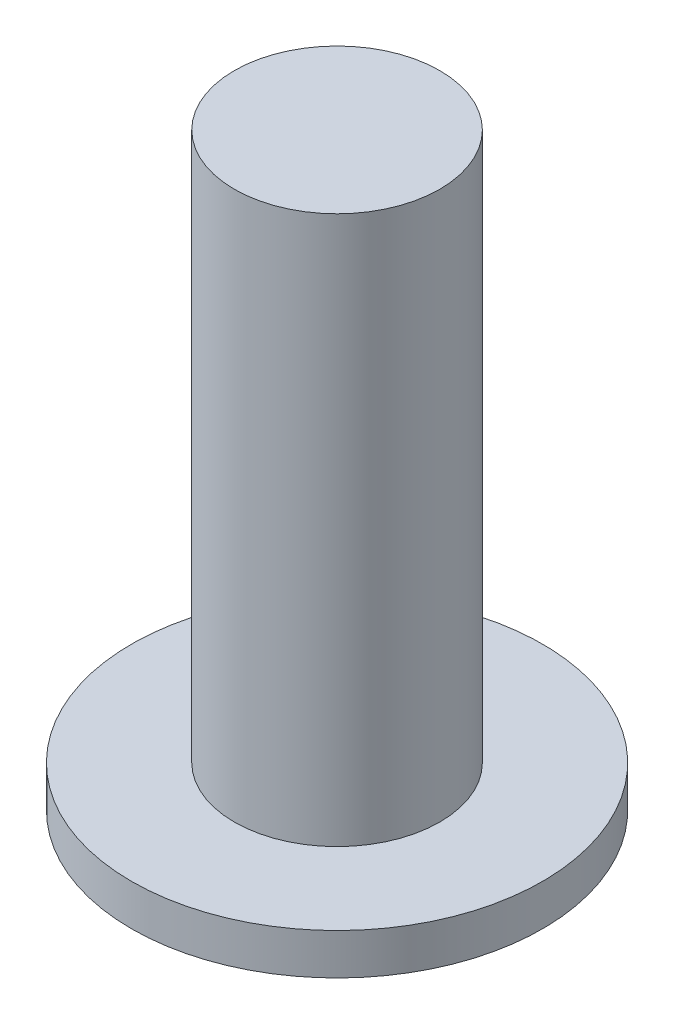
ISO-10303-21;
HEADER;
FILE_DESCRIPTION(('STEP AP214'),'2;1');
FILE_NAME('part.step','',(''),(''),'','','');
FILE_SCHEMA(('AUTOMOTIVE_DESIGN { 1 0 10303 214 1 1 1 1 }'));
ENDSEC;
DATA;
#1=APPLICATION_CONTEXT('core data for automotive mechanical design processes');
#2=APPLICATION_PROTOCOL_DEFINITION('international standard','automotive_design',2000,#1);
#3=PRODUCT_CONTEXT('',#1,'mechanical');
#4=PRODUCT('Part','Part','',(#3));
#5=PRODUCT_RELATED_PRODUCT_CATEGORY('part','',(#4));
#6=PRODUCT_DEFINITION_FORMATION('','',#4);
#7=PRODUCT_DEFINITION_CONTEXT('part definition',#1,'design');
#8=PRODUCT_DEFINITION('design','',#6,#7);
#9=PRODUCT_DEFINITION_SHAPE('','',#8);
#10=(LENGTH_UNIT() NAMED_UNIT(*) SI_UNIT(.MILLI.,.METRE.));
#11=(NAMED_UNIT(*) PLANE_ANGLE_UNIT() SI_UNIT($,.RADIAN.));
#12=(NAMED_UNIT(*) SI_UNIT($,.STERADIAN.) SOLID_ANGLE_UNIT());
#13=UNCERTAINTY_MEASURE_WITH_UNIT(LENGTH_MEASURE(1.E-05),#10,'distance_accuracy_value','');
#14=(GEOMETRIC_REPRESENTATION_CONTEXT(3) GLOBAL_UNCERTAINTY_ASSIGNED_CONTEXT((#13)) GLOBAL_UNIT_ASSIGNED_CONTEXT((#10,
#11,#12)) REPRESENTATION_CONTEXT('',''));
#15=CARTESIAN_POINT('',(0.,0.,0.));
#16=DIRECTION('',(0.,0.,1.));
#17=DIRECTION('',(1.,0.,0.));
#18=AXIS2_PLACEMENT_3D('',#15,#16,#17);
#19=CARTESIAN_POINT('',(0.,30.,0.));
#20=DIRECTION('',(0.,-1.,0.));
#21=DIRECTION('',(0.,0.,-1.));
#22=AXIS2_PLACEMENT_3D('',#19,#20,#21);
#23=CYLINDRICAL_SURFACE('',#22,150.);
#24=CARTESIAN_POINT('',(0.,30.,0.));
#25=DIRECTION('',(0.,1.,0.));
#26=DIRECTION('',(0.,0.,1.));
#27=AXIS2_PLACEMENT_3D('',#24,#25,#26);
#28=CIRCLE('',#27,150.);
#29=CARTESIAN_POINT('',(0.,30.,150.));
#30=VERTEX_POINT('',#29);
#31=EDGE_CURVE('E41',#30,#30,#28,.T.);
#32=ORIENTED_EDGE('',*,*,#31,.F.);
#33=EDGE_LOOP('',(#32));
#34=FACE_BOUND('',#33,.T.);
#35=CARTESIAN_POINT('',(0.,0.,0.));
#36=DIRECTION('',(0.,1.,0.));
#37=DIRECTION('',(0.,0.,1.));
#38=AXIS2_PLACEMENT_3D('',#35,#36,#37);
#39=CIRCLE('',#38,150.);
#40=CARTESIAN_POINT('',(0.,0.,150.));
#41=VERTEX_POINT('',#40);
#42=EDGE_CURVE('E45',#41,#41,#39,.T.);
#43=ORIENTED_EDGE('',*,*,#42,.T.);
#44=EDGE_LOOP('',(#43));
#45=FACE_BOUND('',#44,.T.);
#46=ADVANCED_FACE('F31',(#34,#45),#23,.T.);
#47=CARTESIAN_POINT('',(0.,30.,0.));
#48=DIRECTION('',(0.,1.,0.));
#49=DIRECTION('',(0.,0.,1.));
#50=AXIS2_PLACEMENT_3D('',#47,#48,#49);
#51=PLANE('',#50);
#52=CARTESIAN_POINT('',(0.,30.,0.));
#53=DIRECTION('',(0.,1.,0.));
#54=DIRECTION('',(0.,0.,1.));
#55=AXIS2_PLACEMENT_3D('',#52,#53,#54);
#56=CIRCLE('',#55,75.);
#57=CARTESIAN_POINT('',(0.,30.,75.));
#58=VERTEX_POINT('',#57);
#59=EDGE_CURVE('E52',#58,#58,#56,.T.);
#60=ORIENTED_EDGE('',*,*,#59,.F.);
#61=EDGE_LOOP('',(#60));
#62=FACE_BOUND('',#61,.T.);
#63=ORIENTED_EDGE('',*,*,#31,.T.);
#64=EDGE_LOOP('',(#63));
#65=FACE_BOUND('',#64,.T.);
#66=ADVANCED_FACE('F77',(#62,#65),#51,.T.);
#67=CARTESIAN_POINT('',(0.,0.,0.));
#68=DIRECTION('',(0.,1.,0.));
#69=DIRECTION('',(0.,0.,1.));
#70=AXIS2_PLACEMENT_3D('',#67,#68,#69);
#71=PLANE('',#70);
#72=ORIENTED_EDGE('',*,*,#42,.F.);
#73=EDGE_LOOP('',(#72));
#74=FACE_BOUND('',#73,.T.);
#75=ADVANCED_FACE('F83',(#74),#71,.F.);
#76=CARTESIAN_POINT('',(0.,430.,0.));
#77=DIRECTION('',(0.,-1.,0.));
#78=DIRECTION('',(0.,0.,-1.));
#79=AXIS2_PLACEMENT_3D('',#76,#77,#78);
#80=CYLINDRICAL_SURFACE('',#79,75.);
#81=CARTESIAN_POINT('',(0.,404.99487629361,-75.));
#82=CARTESIAN_POINT('',(-1.25607912812857,404.994875564138,-74.9999993698066));
#83=CARTESIAN_POINT('',(-2.51216621493512,404.947480910228,-74.9683781127444));
#84=CARTESIAN_POINT('',(-5.01407179790327,404.758648172408,-74.8426887060203));
#85=CARTESIAN_POINT('',(-6.25989023998238,404.617209593512,-74.7486202276763));
#86=CARTESIAN_POINT('',(-8.73197178564374,404.24237698436,-74.5003130126054));
#87=CARTESIAN_POINT('',(-9.95822707214632,404.008947108478,-74.3460508208325));
#88=CARTESIAN_POINT('',(-12.3818417737217,403.45347510448,-73.9810246710384));
#89=CARTESIAN_POINT('',(-13.5792008392033,403.131431904889,-73.7702600298146));
#90=CARTESIAN_POINT('',(-15.9317078782539,402.404677491534,-73.2981128358346));
#91=CARTESIAN_POINT('',(-17.0870301802537,402.000368558155,-73.0369769106045));
#92=CARTESIAN_POINT('',(-19.3551767652093,401.112772889994,-72.4689183409078));
#93=CARTESIAN_POINT('',(-20.4680012679968,400.629486563813,-72.1619959333249));
#94=CARTESIAN_POINT('',(-22.6461387426976,399.588703509854,-71.5083591550587));
#95=CARTESIAN_POINT('',(-23.7114516150577,399.031206626588,-71.1616447010027));
#96=CARTESIAN_POINT('',(-25.790674262574,397.846632218866,-70.4347519114061));
#97=CARTESIAN_POINT('',(-26.8045815363435,397.219551313188,-70.0545719498984));
#98=CARTESIAN_POINT('',(-28.861666612515,395.844137976592,-69.2338946093332));
#99=CARTESIAN_POINT('',(-29.9000336318079,395.090032584437,-68.7910162573519));
#100=CARTESIAN_POINT('',(-31.9096887774616,393.509886111997,-67.8821640514135));
#101=CARTESIAN_POINT('',(-32.8809738546755,392.683841765647,-67.4161891492757));
#102=CARTESIAN_POINT('',(-34.7552786574204,390.96280017407,-66.4693490833564));
#103=CARTESIAN_POINT('',(-35.6582055457982,390.067712375426,-65.9884648769671));
#104=CARTESIAN_POINT('',(-37.3921493416695,388.212930166738,-65.0216326378612));
#105=CARTESIAN_POINT('',(-38.2231619954507,387.25323194096,-64.5356843075049));
#106=CARTESIAN_POINT('',(-39.9363542944057,385.115445277059,-63.4920916222783));
#107=CARTESIAN_POINT('',(-40.8058966108144,383.926799591419,-62.9352413406697));
#108=CARTESIAN_POINT('',(-42.4412194084599,381.469790792172,-61.8442348361324));
#109=CARTESIAN_POINT('',(-43.2069763287394,380.201409672683,-61.3100837851243));
#110=CARTESIAN_POINT('',(-44.6279110067148,377.590357210436,-60.2836354938936));
#111=CARTESIAN_POINT('',(-45.2832388239399,376.247790028291,-59.7912819152601));
#112=CARTESIAN_POINT('',(-46.477113565685,373.49165100251,-58.8680528583209));
#113=CARTESIAN_POINT('',(-47.0157165797184,372.078113666007,-58.4371478864466));
#114=CARTESIAN_POINT('',(-47.830072193067,369.604999323424,-57.7708886748411));
#115=CARTESIAN_POINT('',(-48.1368155051018,368.56107672876,-57.5149970636582));
#116=CARTESIAN_POINT('',(-48.6835315046211,366.445078579865,-57.0529757946606));
#117=CARTESIAN_POINT('',(-48.9235150911959,365.3730076524,-56.8468380148399));
#118=CARTESIAN_POINT('',(-49.3331558129826,363.207781105513,-56.4917106885635));
#119=CARTESIAN_POINT('',(-49.5029168061961,362.114659144435,-56.3426367701874));
#120=CARTESIAN_POINT('',(-49.7699049552906,359.912819952143,-56.1069379732519));
#121=CARTESIAN_POINT('',(-49.867131713662,358.804102635495,-56.0203134369341));
#122=CARTESIAN_POINT('',(-49.9875475202756,356.574810871641,-55.9128944879588));
#123=CARTESIAN_POINT('',(-50.0104283098638,355.454206336164,-55.8923741643938));
#124=CARTESIAN_POINT('',(-49.9808494482603,353.214799379829,-55.9188255085255));
#125=CARTESIAN_POINT('',(-49.9283895411501,352.095996965105,-55.9657974054809));
#126=CARTESIAN_POINT('',(-49.7490517210388,349.868314552156,-56.1252713875889));
#127=CARTESIAN_POINT('',(-49.6221185124382,348.759442548905,-56.2378221639021));
#128=CARTESIAN_POINT('',(-49.2960030517688,346.56043525283,-56.523896635261));
#129=CARTESIAN_POINT('',(-49.096819421764,345.470300317768,-56.6974214931824));
#130=CARTESIAN_POINT('',(-48.6396771274884,343.363374579384,-57.0900007448472));
#131=CARTESIAN_POINT('',(-48.3847316806037,342.345479723624,-57.3066828254853));
#132=CARTESIAN_POINT('',(-47.8145330995113,340.336738078613,-57.7832883093608));
#133=CARTESIAN_POINT('',(-47.4992566301012,339.345901925301,-58.0432284391238));
#134=CARTESIAN_POINT('',(-46.8113917004493,337.394766290915,-58.5993950372135));
#135=CARTESIAN_POINT('',(-46.438797308073,336.434469982998,-58.8956252607466));
#136=CARTESIAN_POINT('',(-45.6391782628871,334.546996116042,-59.5174078681792));
#137=CARTESIAN_POINT('',(-45.2121657224681,333.619811245674,-59.8429537222896));
#138=CARTESIAN_POINT('',(-44.2137646179634,331.614541276171,-60.5855151497398));
#139=CARTESIAN_POINT('',(-43.6306819621446,330.544166932534,-61.0076592120658));
#140=CARTESIAN_POINT('',(-42.3925789941529,328.455404496886,-61.8743922620619));
#141=CARTESIAN_POINT('',(-41.7375518119237,327.437021383197,-62.3189833910314));
#142=CARTESIAN_POINT('',(-40.3576530583814,325.453017204421,-63.2213580852144));
#143=CARTESIAN_POINT('',(-39.632705438216,324.487455419969,-63.6791556264036));
#144=CARTESIAN_POINT('',(-38.1158937470748,322.612271529272,-64.5984937314697));
#145=CARTESIAN_POINT('',(-37.3240252312427,321.702653145706,-65.0600345421293));
#146=CARTESIAN_POINT('',(-35.497372051376,319.751620940792,-66.0776235582573));
#147=CARTESIAN_POINT('',(-34.4470402023713,318.724118581485,-66.6325757543582));
#148=CARTESIAN_POINT('',(-32.2536688932062,316.760497228696,-67.7214915689028));
#149=CARTESIAN_POINT('',(-31.1106124377159,315.824395057395,-68.2554513129291));
#150=CARTESIAN_POINT('',(-28.7367153713934,314.051080677518,-69.2883502743307));
#151=CARTESIAN_POINT('',(-27.5059401512503,313.213796016057,-69.7873150396944));
#152=CARTESIAN_POINT('',(-24.9611838354465,311.645463202094,-70.7374190864949));
#153=CARTESIAN_POINT('',(-23.6472257774534,310.914385818463,-71.1885715179035));
#154=CARTESIAN_POINT('',(-21.2083653108556,309.699399932566,-71.9479110139699));
#155=CARTESIAN_POINT('',(-20.0968929420696,309.195132357876,-72.2667869938167));
#156=CARTESIAN_POINT('',(-17.8296258698227,308.265818383993,-72.85929326387));
#157=CARTESIAN_POINT('',(-16.673836366692,307.840762723885,-73.1329288428511));
#158=CARTESIAN_POINT('',(-14.3248068195827,307.074891805132,-73.629069378325));
#159=CARTESIAN_POINT('',(-13.1315925392313,306.734019968167,-73.851608668537));
#160=CARTESIAN_POINT('',(-10.7143858099321,306.140495315282,-74.2408263731253));
#161=CARTESIAN_POINT('',(-9.49039288783282,305.88784385644,-74.4075039281895));
#162=CARTESIAN_POINT('',(-7.01493285874871,305.473443008745,-74.6816447374107));
#163=CARTESIAN_POINT('',(-5.76336899758283,305.312096055782,-74.7888458016147));
#164=CARTESIAN_POINT('',(-3.24779978664342,305.084489912725,-74.9402390053893));
#165=CARTESIAN_POINT('',(-1.98379442061503,305.01823084688,-74.9844310626274));
#166=CARTESIAN_POINT('',(0.546161841066413,304.981856211462,-75.0086794877959));
#167=CARTESIAN_POINT('',(1.81211265438217,305.011736679207,-74.9887384991651));
#168=CARTESIAN_POINT('',(4.33545391961122,305.167157654873,-74.8852333079176));
#169=CARTESIAN_POINT('',(5.59284473457238,305.292694079996,-74.8016718207584));
#170=CARTESIAN_POINT('',(8.00105441027869,305.625298120784,-74.5811036267321));
#171=CARTESIAN_POINT('',(9.1531452914309,305.826005430597,-74.4482725106456));
#172=CARTESIAN_POINT('',(11.4337539392524,306.305791015734,-74.1322766203661));
#173=CARTESIAN_POINT('',(12.5622730289194,306.584864879866,-73.949114679269));
#174=CARTESIAN_POINT('',(14.7892901799927,307.218131913167,-73.5361116664003));
#175=CARTESIAN_POINT('',(15.8877862817803,307.572329972584,-73.3062675558711));
#176=CARTESIAN_POINT('',(18.049159634921,308.352106467448,-72.8042512368363));
#177=CARTESIAN_POINT('',(19.1120349853727,308.777688705059,-72.5320767737295));
#178=CARTESIAN_POINT('',(21.2606669620087,309.724088208852,-71.9326221103305));
#179=CARTESIAN_POINT('',(22.3439174615028,310.249109479372,-71.6030042281149));
#180=CARTESIAN_POINT('',(24.4608128159455,311.370301795432,-70.9077575538377));
#181=CARTESIAN_POINT('',(25.4944561768914,311.966474981948,-70.5421276782251));
#182=CARTESIAN_POINT('',(27.5092556070297,313.225833436575,-69.7810939835077));
#183=CARTESIAN_POINT('',(28.4903864915725,313.88905042573,-69.3856760932846));
#184=CARTESIAN_POINT('',(30.3970494244,315.278243084403,-68.5718169662428));
#185=CARTESIAN_POINT('',(31.3225783792393,316.004222240261,-68.1533744509126));
#186=CARTESIAN_POINT('',(33.2578367830242,317.634994048074,-67.2327199395352));
#187=CARTESIAN_POINT('',(34.2577309571889,318.549907603827,-66.7277262920163));
#188=CARTESIAN_POINT('',(36.1774209126817,320.454710052379,-65.7067457352922));
#189=CARTESIAN_POINT('',(37.0972060552405,321.444608870952,-65.1907573772406));
#190=CARTESIAN_POINT('',(38.8544700404428,323.496370482948,-64.1589349247197));
#191=CARTESIAN_POINT('',(39.691892558769,324.558281695597,-63.6431011730333));
#192=CARTESIAN_POINT('',(41.2805689258953,326.750464755456,-62.6243153729962));
#193=CARTESIAN_POINT('',(42.0318315760824,327.880729602171,-62.121362012974));
#194=CARTESIAN_POINT('',(43.3846567848418,330.108669424688,-61.1832557575179));
#195=CARTESIAN_POINT('',(43.9935060872521,331.201018867336,-60.745965914224));
#196=CARTESIAN_POINT('',(45.1321365873981,333.438763291756,-59.9048518116807));
#197=CARTESIAN_POINT('',(45.6619166396943,334.58415904167,-59.5010280372766));
#198=CARTESIAN_POINT('',(46.6370927792576,336.923222723951,-58.7397976554786));
#199=CARTESIAN_POINT('',(47.0826123234842,338.116816873576,-58.3823233831285));
#200=CARTESIAN_POINT('',(47.8848711143105,340.549189290362,-57.7261478382676));
#201=CARTESIAN_POINT('',(48.2416307641526,341.787957098244,-57.4274330620194));
#202=CARTESIAN_POINT('',(48.8051035565204,344.077419684007,-56.9488612803433));
#203=CARTESIAN_POINT('',(49.0272622949112,345.121876261805,-56.7572902091628));
#204=CARTESIAN_POINT('',(49.4051907333318,347.231204559975,-56.4286284860003));
#205=CARTESIAN_POINT('',(49.5609684301523,348.296073805112,-56.2915312717968));
#206=CARTESIAN_POINT('',(49.8036343737896,350.438648316526,-56.0769505606046));
#207=CARTESIAN_POINT('',(49.8905860975372,351.516340822638,-55.9994121355965));
#208=CARTESIAN_POINT('',(49.9943596361803,353.677828820932,-55.9067879418573));
#209=CARTESIAN_POINT('',(50.0111804275908,354.76162440195,-55.8917030845682));
#210=CARTESIAN_POINT('',(49.9743764128234,356.927664511944,-55.9246124658716));
#211=CARTESIAN_POINT('',(49.920711391999,358.009907802512,-55.9726427138693));
#212=CARTESIAN_POINT('',(49.743813034394,360.164132833201,-56.1299110990069));
#213=CARTESIAN_POINT('',(49.6205802679218,361.23611465737,-56.2391487343755));
#214=CARTESIAN_POINT('',(49.3063738642539,363.363831217295,-56.5148212432596));
#215=CARTESIAN_POINT('',(49.1153231555004,364.41954603625,-56.6813211856706));
#216=CARTESIAN_POINT('',(48.668246146901,366.507579227889,-57.0656505298962));
#217=CARTESIAN_POINT('',(48.4122115013153,367.539894576868,-57.2834865244266));
#218=CARTESIAN_POINT('',(47.7617121012686,369.847955530173,-57.8277047270838));
#219=CARTESIAN_POINT('',(47.3485400103484,371.115278218408,-58.1675437975854));
#220=CARTESIAN_POINT('',(46.4290551441671,373.598567556427,-58.9040695287726));
#221=CARTESIAN_POINT('',(45.9227166943597,374.814519935857,-59.3007718530123));
#222=CARTESIAN_POINT('',(44.821920053201,377.192025765935,-60.1371237319818));
#223=CARTESIAN_POINT('',(44.2273676708542,378.353519301491,-60.5768190194763));
#224=CARTESIAN_POINT('',(42.9552127666317,380.617838692834,-61.485450615398));
#225=CARTESIAN_POINT('',(42.2776146307676,381.720667642548,-61.9543853789177));
#226=CARTESIAN_POINT('',(40.8299760505177,383.884990224259,-62.9180640043835));
#227=CARTESIAN_POINT('',(40.0584799390883,384.945369057572,-63.4131219603741));
#228=CARTESIAN_POINT('',(38.4362771493318,387.000602827111,-64.4093060781157));
#229=CARTESIAN_POINT('',(37.5855706640979,387.995457923056,-64.9104322250716));
#230=CARTESIAN_POINT('',(35.8072393884346,389.917011280661,-65.9081269803492));
#231=CARTESIAN_POINT('',(34.8795925997306,390.843689905845,-66.404694239837));
#232=CARTESIAN_POINT('',(32.9500596955408,392.624891398089,-67.3829668863553));
#233=CARTESIAN_POINT('',(31.9481674136762,393.479408259194,-67.8646710342297));
#234=CARTESIAN_POINT('',(29.7231744369043,395.229346658471,-68.8711034488175));
#235=CARTESIAN_POINT('',(28.4889830231092,396.112975680665,-69.3920555799811));
#236=CARTESIAN_POINT('',(26.5715366554009,397.356823453753,-70.1386126939225));
#237=CARTESIAN_POINT('',(25.9211928714759,397.757928880933,-70.3817088331226));
#238=CARTESIAN_POINT('',(24.5992016728248,398.531822171812,-70.8545815995358));
#239=CARTESIAN_POINT('',(23.9275571994125,398.904613921288,-71.0843600534431));
#240=CARTESIAN_POINT('',(22.5646154672259,399.62031744433,-71.5286753997611));
#241=CARTESIAN_POINT('',(21.8733399735978,399.963260718118,-71.7432283149778));
#242=CARTESIAN_POINT('',(20.4716502058407,400.618444087384,-72.1557008218277));
#243=CARTESIAN_POINT('',(19.7612386262073,400.930688476988,-72.3536227392218));
#244=CARTESIAN_POINT('',(18.3226242260034,401.523216030592,-72.7312468729747));
#245=CARTESIAN_POINT('',(17.5944252166648,401.803505969639,-72.9109529505929));
#246=CARTESIAN_POINT('',(16.1217137732562,402.330932986949,-73.2506766639481));
#247=CARTESIAN_POINT('',(15.3772025358917,402.578072487799,-73.4106957383127));
#248=CARTESIAN_POINT('',(13.455759812162,403.165793758871,-73.7927029838492));
#249=CARTESIAN_POINT('',(12.2682623403824,403.482065316043,-73.9997650188331));
#250=CARTESIAN_POINT('',(9.86541480743964,404.027430584375,-74.3582490412697));
#251=CARTESIAN_POINT('',(8.6500692741687,404.256538362582,-74.5096800066828));
#252=CARTESIAN_POINT('',(6.20060249680809,404.624354115503,-74.7533681632261));
#253=CARTESIAN_POINT('',(4.9664933075011,404.763117813014,-74.8456618287473));
#254=CARTESIAN_POINT('',(2.48825893076016,404.948380993723,-74.9689792083349));
#255=CARTESIAN_POINT('',(1.24413336938914,404.994877016143,-75.0000006242001));
#256=CARTESIAN_POINT('',(0.,404.99487629361,-75.));
#257=B_SPLINE_CURVE_WITH_KNOTS('',3,(#81,#82,#83,#84,#85,#86,#87,#88,#89,#90,#91,#92,#93,#94,
#95,#96,#97,#98,#99,#100,#101,#102,#103,#104,#105,#106,#107,#108,#109,#110,#111,#112,#113,#114,
#115,#116,#117,#118,#119,#120,#121,#122,#123,#124,#125,#126,#127,#128,#129,#130,#131,#132,#133,
#134,#135,#136,#137,#138,#139,#140,#141,#142,#143,#144,#145,#146,#147,#148,#149,#150,#151,#152,
#153,#154,#155,#156,#157,#158,#159,#160,#161,#162,#163,#164,#165,#166,#167,#168,#169,#170,#171,
#172,#173,#174,#175,#176,#177,#178,#179,#180,#181,#182,#183,#184,#185,#186,#187,#188,#189,#190,
#191,#192,#193,#194,#195,#196,#197,#198,#199,#200,#201,#202,#203,#204,#205,#206,#207,#208,#209,
#210,#211,#212,#213,#214,#215,#216,#217,#218,#219,#220,#221,#222,#223,#224,#225,#226,#227,#228,
#229,#230,#231,#232,#233,#234,#235,#236,#237,#238,#239,#240,#241,#242,#243,#244,#245,#246,#247,
#248,#249,#250,#251,#252,#253,#254,#255,#256),.UNSPECIFIED.,.T.,.F.,(4,2,2,2,2,2,2,2,2,2,2,2,2,
2,2,2,2,2,2,2,2,2,2,2,2,2,2,2,2,2,2,2,2,2,2,2,2,2,2,2,2,2,2,2,2,2,2,2,2,2,2,2,2,2,2,2,2,2,2,2,2,
2,2,2,2,2,2,2,2,2,2,2,2,2,2,2,2,2,2,2,2,2,2,2,2,2,2,4),(0.,3.76697150072695,7.53396282853041,
11.3024234680557,15.0709296761986,18.8214325723349,22.5719160653104,26.3224074164752,
30.0730810910323,34.141861205373,38.210826140764,42.2852215284476,46.3598577513007,
51.0778298215588,55.7968711598866,60.5094472669166,65.2197538041429,68.5699127449499,
71.9195244225309,75.264164215253,78.6088223374842,81.9673307454575,85.3258505616889,
88.6868672029977,92.0479479478735,95.2593158531844,98.4719283908937,101.684873642799,
104.897105002351,108.763339363902,112.62994323762,116.500801088235,120.371916241882,
125.078303989426,129.785556320075,134.489335570625,139.191817750587,142.972498988838,
146.752737938096,150.530429305254,154.308178781368,158.102451993363,161.896730163245,
165.6908519424,169.484811789483,173.011740675818,176.538471073815,180.06543111657,
183.592579076797,187.333121302462,191.073776110268,194.816209126207,198.5588501621,
202.893439895313,207.228604402767,211.566713227871,215.904378511816,219.875264658992,
223.846208324979,227.811287982455,231.775455342955,235.026760762181,238.277674392377,
241.525586259748,244.773545526703,248.023358674371,251.273145180825,254.526636786819,
257.780546442987,261.90140788508,266.023406649062,270.149838807211,274.276053124166,
278.47722241686,282.678381468524,286.880745856674,291.083459659651,295.890616694141,
298.295380923209,300.699814523068,303.101679061604,305.503207150581,307.904225112099,
310.305067514903,314.038981531073,317.772292688552,321.503299012028,325.23444527554),.UNSPECIFIED.);
#258=CARTESIAN_POINT('',(0.,404.99487629361,-75.));
#259=VERTEX_POINT('',#258);
#260=EDGE_CURVE('E10',#259,#259,#257,.T.);
#261=ORIENTED_EDGE('',*,*,#260,.T.);
#262=EDGE_LOOP('',(#261));
#263=FACE_BOUND('',#262,.T.);
#264=CARTESIAN_POINT('',(0.,430.,0.));
#265=DIRECTION('',(0.,1.,0.));
#266=DIRECTION('',(0.,0.,1.));
#267=AXIS2_PLACEMENT_3D('',#264,#265,#266);
#268=CIRCLE('',#267,75.);
#269=CARTESIAN_POINT('',(0.,430.,75.));
#270=VERTEX_POINT('',#269);
#271=EDGE_CURVE('E50',#270,#270,#268,.T.);
#272=ORIENTED_EDGE('',*,*,#271,.F.);
#273=EDGE_LOOP('',(#272));
#274=FACE_BOUND('',#273,.T.);
#275=ORIENTED_EDGE('',*,*,#59,.T.);
#276=EDGE_LOOP('',(#275));
#277=FACE_BOUND('',#276,.T.);
#278=ADVANCED_FACE('F72',(#263,#274,#277),#80,.T.);
#279=CARTESIAN_POINT('',(0.,430.,0.));
#280=DIRECTION('',(0.,1.,0.));
#281=DIRECTION('',(0.,0.,1.));
#282=AXIS2_PLACEMENT_3D('',#279,#280,#281);
#283=PLANE('',#282);
#284=ORIENTED_EDGE('',*,*,#271,.T.);
#285=EDGE_LOOP('',(#284));
#286=FACE_BOUND('',#285,.T.);
#287=ADVANCED_FACE('F66',(#286),#283,.T.);
#288=CARTESIAN_POINT('',(0.,354.99487629361,25.));
#289=DIRECTION('',(0.,0.,-1.));
#290=DIRECTION('',(-1.,0.,0.));
#291=AXIS2_PLACEMENT_3D('',#288,#289,#290);
#292=CYLINDRICAL_SURFACE('',#291,50.);
#293=CARTESIAN_POINT('',(0.,354.99487629361,25.));
#294=DIRECTION('',(0.,0.,-1.));
#295=DIRECTION('',(-1.,0.,0.));
#296=AXIS2_PLACEMENT_3D('',#293,#294,#295);
#297=CIRCLE('',#296,50.);
#298=CARTESIAN_POINT('',(-50.,354.99487629361,25.));
#299=VERTEX_POINT('',#298);
#300=EDGE_CURVE('E55',#299,#299,#297,.T.);
#301=ORIENTED_EDGE('',*,*,#300,.F.);
#302=EDGE_LOOP('',(#301));
#303=FACE_BOUND('',#302,.T.);
#304=ORIENTED_EDGE('',*,*,#260,.F.);
#305=EDGE_LOOP('',(#304));
#306=FACE_BOUND('',#305,.T.);
#307=ADVANCED_FACE('F63',(#303,#306),#292,.F.);
#308=CARTESIAN_POINT('',(0.,354.99487629361,25.));
#309=DIRECTION('',(0.,0.,-1.));
#310=DIRECTION('',(-1.,0.,0.));
#311=AXIS2_PLACEMENT_3D('',#308,#309,#310);
#312=PLANE('',#311);
#313=ORIENTED_EDGE('',*,*,#300,.T.);
#314=EDGE_LOOP('',(#313));
#315=FACE_BOUND('',#314,.T.);
#316=ADVANCED_FACE('F61',(#315),#312,.T.);
#317=CLOSED_SHELL('',(#46,#66,#75,#278,#287,#307,#316));
#318=MANIFOLD_SOLID_BREP('B2',#317);
#319=ADVANCED_BREP_SHAPE_REPRESENTATION('',(#18,#318),#14);
#320=SHAPE_DEFINITION_REPRESENTATION(#9,#319);
ENDSEC;
END-ISO-10303-21;
